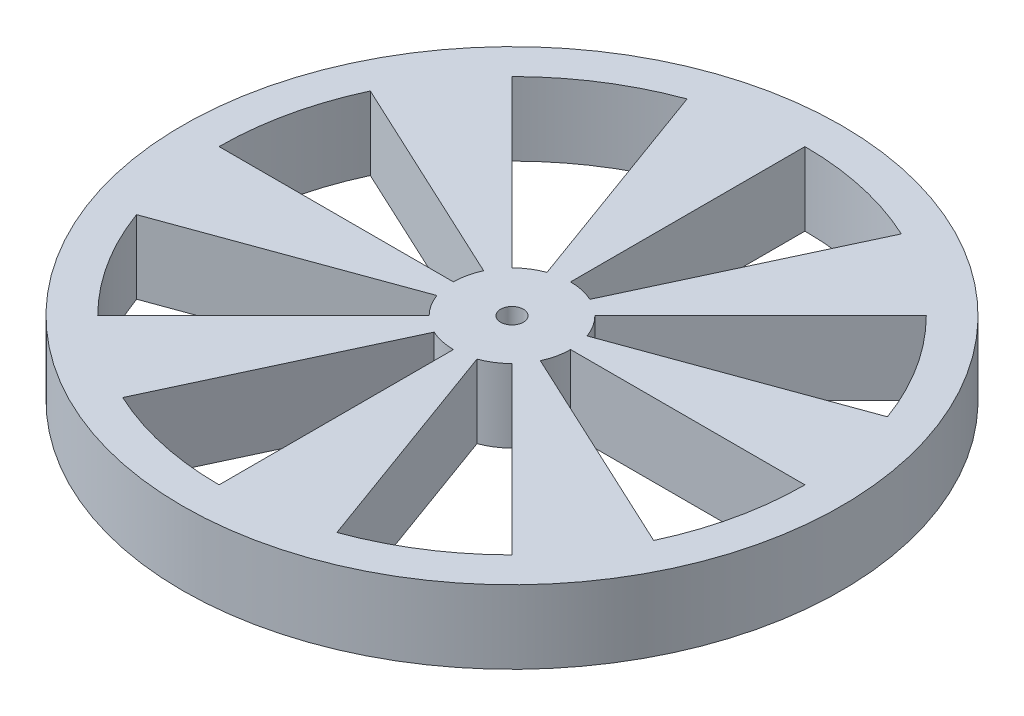
ISO-10303-21;
HEADER;
FILE_DESCRIPTION(('STEP AP214'),'2;1');
FILE_NAME('part.step','',(''),(''),'','','');
FILE_SCHEMA(('AUTOMOTIVE_DESIGN { 1 0 10303 214 1 1 1 1 }'));
ENDSEC;
DATA;
#1=APPLICATION_CONTEXT('core data for automotive mechanical design processes');
#2=APPLICATION_PROTOCOL_DEFINITION('international standard','automotive_design',2000,#1);
#3=PRODUCT_CONTEXT('',#1,'mechanical');
#4=PRODUCT('Part','Part','',(#3));
#5=PRODUCT_RELATED_PRODUCT_CATEGORY('part','',(#4));
#6=PRODUCT_DEFINITION_FORMATION('','',#4);
#7=PRODUCT_DEFINITION_CONTEXT('part definition',#1,'design');
#8=PRODUCT_DEFINITION('design','',#6,#7);
#9=PRODUCT_DEFINITION_SHAPE('','',#8);
#10=(LENGTH_UNIT() NAMED_UNIT(*) SI_UNIT(.MILLI.,.METRE.));
#11=(NAMED_UNIT(*) PLANE_ANGLE_UNIT() SI_UNIT($,.RADIAN.));
#12=(NAMED_UNIT(*) SI_UNIT($,.STERADIAN.) SOLID_ANGLE_UNIT());
#13=UNCERTAINTY_MEASURE_WITH_UNIT(LENGTH_MEASURE(1.E-05),#10,'distance_accuracy_value','');
#14=(GEOMETRIC_REPRESENTATION_CONTEXT(3) GLOBAL_UNCERTAINTY_ASSIGNED_CONTEXT((#13)) GLOBAL_UNIT_ASSIGNED_CONTEXT((#10,
#11,#12)) REPRESENTATION_CONTEXT('',''));
#15=CARTESIAN_POINT('',(0.,0.,0.));
#16=DIRECTION('',(0.,0.,1.));
#17=DIRECTION('',(1.,0.,0.));
#18=AXIS2_PLACEMENT_3D('',#15,#16,#17);
#19=CARTESIAN_POINT('',(0.,10.,0.));
#20=DIRECTION('',(0.,-1.,0.));
#21=DIRECTION('',(0.,0.,-1.));
#22=AXIS2_PLACEMENT_3D('',#19,#20,#21);
#23=CYLINDRICAL_SURFACE('',#22,8.);
#24=CARTESIAN_POINT('',(0.,0.,0.));
#25=DIRECTION('',(0.,1.,0.));
#26=DIRECTION('',(0.,0.,1.));
#27=AXIS2_PLACEMENT_3D('',#24,#25,#26);
#28=CIRCLE('',#27,8.);
#29=CARTESIAN_POINT('',(-2.7361611466054,0.,-7.51754096628725));
#30=VERTEX_POINT('',#29);
#31=CARTESIAN_POINT('',(-5.65685424949231,0.,-5.65685424949245));
#32=VERTEX_POINT('',#31);
#33=EDGE_CURVE('E308',#30,#32,#28,.T.);
#34=ORIENTED_EDGE('',*,*,#33,.T.);
#35=DIRECTION('',(0.,-1.,0.));
#36=VECTOR('',#35,1.);
#37=CARTESIAN_POINT('',(-5.65685424949231,10.,-5.65685424949245));
#38=LINE('',#37,#36);
#39=CARTESIAN_POINT('',(-5.65685424949231,10.,-5.65685424949245));
#40=VERTEX_POINT('',#39);
#41=EDGE_CURVE('E11',#40,#32,#38,.T.);
#42=ORIENTED_EDGE('',*,*,#41,.F.);
#43=CARTESIAN_POINT('',(0.,10.,0.));
#44=DIRECTION('',(0.,1.,0.));
#45=DIRECTION('',(0.,0.,1.));
#46=AXIS2_PLACEMENT_3D('',#43,#44,#45);
#47=CIRCLE('',#46,8.);
#48=CARTESIAN_POINT('',(-2.7361611466054,10.,-7.51754096628725));
#49=VERTEX_POINT('',#48);
#50=EDGE_CURVE('E278',#49,#40,#47,.T.);
#51=ORIENTED_EDGE('',*,*,#50,.F.);
#52=DIRECTION('',(0.,-1.,0.));
#53=VECTOR('',#52,1.);
#54=CARTESIAN_POINT('',(-2.7361611466054,10.,-7.51754096628725));
#55=LINE('',#54,#53);
#56=EDGE_CURVE('E65',#49,#30,#55,.T.);
#57=ORIENTED_EDGE('',*,*,#56,.T.);
#58=EDGE_LOOP('',(#34,#42,#51,#57));
#59=FACE_BOUND('',#58,.T.);
#60=ADVANCED_FACE('F45',(#59),#23,.T.);
#61=CARTESIAN_POINT('',(0.,10.,0.));
#62=DIRECTION('',(0.707106781186556,0.,-0.707106781186539));
#63=DIRECTION('',(-0.707106781186539,0.,-0.707106781186556));
#64=AXIS2_PLACEMENT_3D('',#61,#62,#63);
#65=PLANE('',#64);
#66=DIRECTION('',(0.707106781186539,0.,0.707106781186556));
#67=VECTOR('',#66,1.);
#68=CARTESIAN_POINT('',(0.,0.,0.));
#69=LINE('',#68,#67);
#70=CARTESIAN_POINT('',(-28.2842712474616,0.,-28.2842712474622));
#71=VERTEX_POINT('',#70);
#72=EDGE_CURVE('E266',#71,#32,#69,.T.);
#73=ORIENTED_EDGE('',*,*,#72,.F.);
#74=DIRECTION('',(0.,-1.,0.));
#75=VECTOR('',#74,1.);
#76=CARTESIAN_POINT('',(-28.2842712474616,10.,-28.2842712474622));
#77=LINE('',#76,#75);
#78=CARTESIAN_POINT('',(-28.2842712474616,10.,-28.2842712474622));
#79=VERTEX_POINT('',#78);
#80=EDGE_CURVE('E56',#79,#71,#77,.T.);
#81=ORIENTED_EDGE('',*,*,#80,.F.);
#82=DIRECTION('',(0.707106781186539,0.,0.707106781186556));
#83=VECTOR('',#82,1.);
#84=CARTESIAN_POINT('',(0.,10.,0.));
#85=LINE('',#84,#83);
#86=EDGE_CURVE('E264',#79,#40,#85,.T.);
#87=ORIENTED_EDGE('',*,*,#86,.T.);
#88=ORIENTED_EDGE('',*,*,#41,.T.);
#89=EDGE_LOOP('',(#73,#81,#87,#88));
#90=FACE_BOUND('',#89,.T.);
#91=ADVANCED_FACE('F263',(#90),#65,.T.);
#92=CARTESIAN_POINT('',(0.,10.,0.));
#93=DIRECTION('',(0.,-1.,0.));
#94=DIRECTION('',(0.,0.,-1.));
#95=AXIS2_PLACEMENT_3D('',#92,#93,#94);
#96=CYLINDRICAL_SURFACE('',#95,40.);
#97=CARTESIAN_POINT('',(0.,0.,0.));
#98=DIRECTION('',(0.,1.,0.));
#99=DIRECTION('',(0.,0.,1.));
#100=AXIS2_PLACEMENT_3D('',#97,#98,#99);
#101=CIRCLE('',#100,40.);
#102=CARTESIAN_POINT('',(-13.680805733027,0.,-37.5877048314362));
#103=VERTEX_POINT('',#102);
#104=EDGE_CURVE('E396',#103,#71,#101,.T.);
#105=ORIENTED_EDGE('',*,*,#104,.F.);
#106=DIRECTION('',(0.,-1.,0.));
#107=VECTOR('',#106,1.);
#108=CARTESIAN_POINT('',(-13.680805733027,10.,-37.5877048314362));
#109=LINE('',#108,#107);
#110=CARTESIAN_POINT('',(-13.680805733027,10.,-37.5877048314362));
#111=VERTEX_POINT('',#110);
#112=EDGE_CURVE('E162',#111,#103,#109,.T.);
#113=ORIENTED_EDGE('',*,*,#112,.F.);
#114=CARTESIAN_POINT('',(0.,10.,0.));
#115=DIRECTION('',(0.,1.,0.));
#116=DIRECTION('',(0.,0.,1.));
#117=AXIS2_PLACEMENT_3D('',#114,#115,#116);
#118=CIRCLE('',#117,40.);
#119=EDGE_CURVE('E277',#111,#79,#118,.T.);
#120=ORIENTED_EDGE('',*,*,#119,.T.);
#121=ORIENTED_EDGE('',*,*,#80,.T.);
#122=EDGE_LOOP('',(#105,#113,#120,#121));
#123=FACE_BOUND('',#122,.T.);
#124=ADVANCED_FACE('F282',(#123),#96,.F.);
#125=CARTESIAN_POINT('',(0.,10.,0.));
#126=DIRECTION('',(-0.422618261740694,0.,0.906307787036653));
#127=DIRECTION('',(0.906307787036653,0.,0.422618261740694));
#128=AXIS2_PLACEMENT_3D('',#125,#126,#127);
#129=PLANE('',#128);
#130=DIRECTION('',(-0.906307787036653,0.,-0.422618261740693));
#131=VECTOR('',#130,1.);
#132=CARTESIAN_POINT('',(0.,0.,0.));
#133=LINE('',#132,#131);
#134=CARTESIAN_POINT('',(-7.25046229629322,0.,-3.38094609392555));
#135=VERTEX_POINT('',#134);
#136=CARTESIAN_POINT('',(-36.2523114814661,0.,-16.9047304696277));
#137=VERTEX_POINT('',#136);
#138=EDGE_CURVE('E381',#135,#137,#133,.T.);
#139=ORIENTED_EDGE('',*,*,#138,.F.);
#140=DIRECTION('',(0.,-1.,0.));
#141=VECTOR('',#140,1.);
#142=CARTESIAN_POINT('',(-7.25046229629322,10.,-3.38094609392555));
#143=LINE('',#142,#141);
#144=CARTESIAN_POINT('',(-7.25046229629322,10.,-3.38094609392555));
#145=VERTEX_POINT('',#144);
#146=EDGE_CURVE('E414',#145,#135,#143,.T.);
#147=ORIENTED_EDGE('',*,*,#146,.F.);
#148=DIRECTION('',(-0.906307787036653,0.,-0.422618261740693));
#149=VECTOR('',#148,1.);
#150=CARTESIAN_POINT('',(0.,10.,0.));
#151=LINE('',#150,#149);
#152=CARTESIAN_POINT('',(-36.2523114814661,10.,-16.9047304696277));
#153=VERTEX_POINT('',#152);
#154=EDGE_CURVE('E694',#145,#153,#151,.T.);
#155=ORIENTED_EDGE('',*,*,#154,.T.);
#156=DIRECTION('',(0.,-1.,0.));
#157=VECTOR('',#156,1.);
#158=CARTESIAN_POINT('',(-36.2523114814661,10.,-16.9047304696277));
#159=LINE('',#158,#157);
#160=EDGE_CURVE('E417',#153,#137,#159,.T.);
#161=ORIENTED_EDGE('',*,*,#160,.T.);
#162=EDGE_LOOP('',(#139,#147,#155,#161));
#163=FACE_BOUND('',#162,.T.);
#164=ADVANCED_FACE('F536',(#163),#129,.T.);
#165=CARTESIAN_POINT('',(-8.,0.,0.));
#166=VERTEX_POINT('',#165);
#167=EDGE_CURVE('E385',#135,#166,#28,.T.);
#168=ORIENTED_EDGE('',*,*,#167,.T.);
#169=DIRECTION('',(0.,-1.,0.));
#170=VECTOR('',#169,1.);
#171=CARTESIAN_POINT('',(-8.,10.,0.));
#172=LINE('',#171,#170);
#173=CARTESIAN_POINT('',(-8.,10.,0.));
#174=VERTEX_POINT('',#173);
#175=EDGE_CURVE('E424',#174,#166,#172,.T.);
#176=ORIENTED_EDGE('',*,*,#175,.F.);
#177=EDGE_CURVE('E698',#145,#174,#47,.T.);
#178=ORIENTED_EDGE('',*,*,#177,.F.);
#179=ORIENTED_EDGE('',*,*,#146,.T.);
#180=EDGE_LOOP('',(#168,#176,#178,#179));
#181=FACE_BOUND('',#180,.T.);
#182=ADVANCED_FACE('F528',(#181),#23,.T.);
#183=CARTESIAN_POINT('',(0.,10.,0.));
#184=DIRECTION('',(0.,0.,-1.));
#185=DIRECTION('',(-1.,0.,0.));
#186=AXIS2_PLACEMENT_3D('',#183,#184,#185);
#187=PLANE('',#186);
#188=DIRECTION('',(1.,0.,0.));
#189=VECTOR('',#188,1.);
#190=CARTESIAN_POINT('',(0.,0.,0.));
#191=LINE('',#190,#189);
#192=CARTESIAN_POINT('',(-40.,0.,-4.18977760661176E-13));
#193=VERTEX_POINT('',#192);
#194=EDGE_CURVE('E386',#193,#166,#191,.T.);
#195=ORIENTED_EDGE('',*,*,#194,.F.);
#196=DIRECTION('',(0.,-1.,0.));
#197=VECTOR('',#196,1.);
#198=CARTESIAN_POINT('',(-40.,10.,-4.18977760661176E-13));
#199=LINE('',#198,#197);
#200=CARTESIAN_POINT('',(-40.,10.,-4.18977760661176E-13));
#201=VERTEX_POINT('',#200);
#202=EDGE_CURVE('E420',#201,#193,#199,.T.);
#203=ORIENTED_EDGE('',*,*,#202,.F.);
#204=DIRECTION('',(1.,0.,0.));
#205=VECTOR('',#204,1.);
#206=CARTESIAN_POINT('',(0.,10.,0.));
#207=LINE('',#206,#205);
#208=EDGE_CURVE('E699',#201,#174,#207,.T.);
#209=ORIENTED_EDGE('',*,*,#208,.T.);
#210=ORIENTED_EDGE('',*,*,#175,.T.);
#211=EDGE_LOOP('',(#195,#203,#209,#210));
#212=FACE_BOUND('',#211,.T.);
#213=ADVANCED_FACE('F535',(#212),#187,.T.);
#214=CARTESIAN_POINT('',(0.,10.,0.));
#215=DIRECTION('',(0.342020143325675,0.,0.939692620785906));
#216=DIRECTION('',(0.939692620785906,0.,-0.342020143325675));
#217=AXIS2_PLACEMENT_3D('',#214,#215,#216);
#218=PLANE('',#217);
#219=DIRECTION('',(-0.939692620785906,0.,0.342020143325675));
#220=VECTOR('',#219,1.);
#221=CARTESIAN_POINT('',(0.,0.,0.));
#222=LINE('',#221,#220);
#223=CARTESIAN_POINT('',(-7.51754096628725,0.,2.7361611466054));
#224=VERTEX_POINT('',#223);
#225=CARTESIAN_POINT('',(-37.5877048314362,0.,13.680805733027));
#226=VERTEX_POINT('',#225);
#227=EDGE_CURVE('E368',#224,#226,#222,.T.);
#228=ORIENTED_EDGE('',*,*,#227,.F.);
#229=DIRECTION('',(0.,-1.,0.));
#230=VECTOR('',#229,1.);
#231=CARTESIAN_POINT('',(-7.51754096628725,10.,2.7361611466054));
#232=LINE('',#231,#230);
#233=CARTESIAN_POINT('',(-7.51754096628725,10.,2.7361611466054));
#234=VERTEX_POINT('',#233);
#235=EDGE_CURVE('E421',#234,#224,#232,.T.);
#236=ORIENTED_EDGE('',*,*,#235,.F.);
#237=DIRECTION('',(-0.939692620785906,0.,0.342020143325675));
#238=VECTOR('',#237,1.);
#239=CARTESIAN_POINT('',(0.,10.,0.));
#240=LINE('',#239,#238);
#241=CARTESIAN_POINT('',(-37.5877048314362,10.,13.680805733027));
#242=VERTEX_POINT('',#241);
#243=EDGE_CURVE('E681',#234,#242,#240,.T.);
#244=ORIENTED_EDGE('',*,*,#243,.T.);
#245=DIRECTION('',(0.,-1.,0.));
#246=VECTOR('',#245,1.);
#247=CARTESIAN_POINT('',(-37.5877048314362,10.,13.680805733027));
#248=LINE('',#247,#246);
#249=EDGE_CURVE('E429',#242,#226,#248,.T.);
#250=ORIENTED_EDGE('',*,*,#249,.T.);
#251=EDGE_LOOP('',(#228,#236,#244,#250));
#252=FACE_BOUND('',#251,.T.);
#253=ADVANCED_FACE('F543',(#252),#218,.T.);
#254=CARTESIAN_POINT('',(-5.65685424949243,0.,5.65685424949233));
#255=VERTEX_POINT('',#254);
#256=EDGE_CURVE('E372',#224,#255,#28,.T.);
#257=ORIENTED_EDGE('',*,*,#256,.T.);
#258=DIRECTION('',(0.,-1.,0.));
#259=VECTOR('',#258,1.);
#260=CARTESIAN_POINT('',(-5.65685424949243,10.,5.65685424949233));
#261=LINE('',#260,#259);
#262=CARTESIAN_POINT('',(-5.65685424949243,10.,5.65685424949233));
#263=VERTEX_POINT('',#262);
#264=EDGE_CURVE('E436',#263,#255,#261,.T.);
#265=ORIENTED_EDGE('',*,*,#264,.F.);
#266=EDGE_CURVE('E685',#234,#263,#47,.T.);
#267=ORIENTED_EDGE('',*,*,#266,.F.);
#268=ORIENTED_EDGE('',*,*,#235,.T.);
#269=EDGE_LOOP('',(#257,#265,#267,#268));
#270=FACE_BOUND('',#269,.T.);
#271=ADVANCED_FACE('F538',(#270),#23,.T.);
#272=CARTESIAN_POINT('',(0.,10.,0.));
#273=DIRECTION('',(-0.707106781186541,0.,-0.707106781186554));
#274=DIRECTION('',(-0.707106781186554,0.,0.707106781186541));
#275=AXIS2_PLACEMENT_3D('',#272,#273,#274);
#276=PLANE('',#275);
#277=DIRECTION('',(0.707106781186554,0.,-0.707106781186541));
#278=VECTOR('',#277,1.);
#279=CARTESIAN_POINT('',(0.,0.,0.));
#280=LINE('',#279,#278);
#281=CARTESIAN_POINT('',(-28.2842712474621,0.,28.2842712474617));
#282=VERTEX_POINT('',#281);
#283=EDGE_CURVE('E373',#282,#255,#280,.T.);
#284=ORIENTED_EDGE('',*,*,#283,.F.);
#285=DIRECTION('',(0.,-1.,0.));
#286=VECTOR('',#285,1.);
#287=CARTESIAN_POINT('',(-28.2842712474621,10.,28.2842712474617));
#288=LINE('',#287,#286);
#289=CARTESIAN_POINT('',(-28.2842712474621,10.,28.2842712474617));
#290=VERTEX_POINT('',#289);
#291=EDGE_CURVE('E432',#290,#282,#288,.T.);
#292=ORIENTED_EDGE('',*,*,#291,.F.);
#293=DIRECTION('',(0.707106781186554,0.,-0.707106781186541));
#294=VECTOR('',#293,1.);
#295=CARTESIAN_POINT('',(0.,10.,0.));
#296=LINE('',#295,#294);
#297=EDGE_CURVE('E686',#290,#263,#296,.T.);
#298=ORIENTED_EDGE('',*,*,#297,.T.);
#299=ORIENTED_EDGE('',*,*,#264,.T.);
#300=EDGE_LOOP('',(#284,#292,#298,#299));
#301=FACE_BOUND('',#300,.T.);
#302=ADVANCED_FACE('F550',(#301),#276,.T.);
#303=CARTESIAN_POINT('',(0.,10.,0.));
#304=DIRECTION('',(0.906307787036653,0.,0.422618261740694));
#305=DIRECTION('',(0.422618261740694,0.,-0.906307787036653));
#306=AXIS2_PLACEMENT_3D('',#303,#304,#305);
#307=PLANE('',#306);
#308=DIRECTION('',(-0.422618261740693,0.,0.906307787036653));
#309=VECTOR('',#308,1.);
#310=CARTESIAN_POINT('',(0.,0.,0.));
#311=LINE('',#310,#309);
#312=CARTESIAN_POINT('',(-3.38094609392555,0.,7.25046229629322));
#313=VERTEX_POINT('',#312);
#314=CARTESIAN_POINT('',(-16.9047304696277,0.,36.2523114814661));
#315=VERTEX_POINT('',#314);
#316=EDGE_CURVE('E355',#313,#315,#311,.T.);
#317=ORIENTED_EDGE('',*,*,#316,.F.);
#318=DIRECTION('',(0.,-1.,0.));
#319=VECTOR('',#318,1.);
#320=CARTESIAN_POINT('',(-3.38094609392555,10.,7.25046229629322));
#321=LINE('',#320,#319);
#322=CARTESIAN_POINT('',(-3.38094609392555,10.,7.25046229629322));
#323=VERTEX_POINT('',#322);
#324=EDGE_CURVE('E433',#323,#313,#321,.T.);
#325=ORIENTED_EDGE('',*,*,#324,.F.);
#326=DIRECTION('',(-0.422618261740693,0.,0.906307787036653));
#327=VECTOR('',#326,1.);
#328=CARTESIAN_POINT('',(0.,10.,0.));
#329=LINE('',#328,#327);
#330=CARTESIAN_POINT('',(-16.9047304696277,10.,36.2523114814661));
#331=VERTEX_POINT('',#330);
#332=EDGE_CURVE('E668',#323,#331,#329,.T.);
#333=ORIENTED_EDGE('',*,*,#332,.T.);
#334=DIRECTION('',(0.,-1.,0.));
#335=VECTOR('',#334,1.);
#336=CARTESIAN_POINT('',(-16.9047304696277,10.,36.2523114814661));
#337=LINE('',#336,#335);
#338=EDGE_CURVE('E441',#331,#315,#337,.T.);
#339=ORIENTED_EDGE('',*,*,#338,.T.);
#340=EDGE_LOOP('',(#317,#325,#333,#339));
#341=FACE_BOUND('',#340,.T.);
#342=ADVANCED_FACE('F557',(#341),#307,.T.);
#343=CARTESIAN_POINT('',(0.,0.,8.));
#344=VERTEX_POINT('',#343);
#345=EDGE_CURVE('E359',#313,#344,#28,.T.);
#346=ORIENTED_EDGE('',*,*,#345,.T.);
#347=DIRECTION('',(0.,-1.,0.));
#348=VECTOR('',#347,1.);
#349=CARTESIAN_POINT('',(0.,10.,8.));
#350=LINE('',#349,#348);
#351=CARTESIAN_POINT('',(0.,10.,8.));
#352=VERTEX_POINT('',#351);
#353=EDGE_CURVE('E448',#352,#344,#350,.T.);
#354=ORIENTED_EDGE('',*,*,#353,.F.);
#355=EDGE_CURVE('E672',#323,#352,#47,.T.);
#356=ORIENTED_EDGE('',*,*,#355,.F.);
#357=ORIENTED_EDGE('',*,*,#324,.T.);
#358=EDGE_LOOP('',(#346,#354,#356,#357));
#359=FACE_BOUND('',#358,.T.);
#360=ADVANCED_FACE('F552',(#359),#23,.T.);
#361=CARTESIAN_POINT('',(0.,10.,0.));
#362=DIRECTION('',(-1.,0.,0.));
#363=DIRECTION('',(0.,0.,1.));
#364=AXIS2_PLACEMENT_3D('',#361,#362,#363);
#365=PLANE('',#364);
#366=DIRECTION('',(0.,0.,-1.));
#367=VECTOR('',#366,1.);
#368=CARTESIAN_POINT('',(0.,0.,0.));
#369=LINE('',#368,#367);
#370=CARTESIAN_POINT('',(-2.79318507107451E-13,0.,40.));
#371=VERTEX_POINT('',#370);
#372=EDGE_CURVE('E360',#371,#344,#369,.T.);
#373=ORIENTED_EDGE('',*,*,#372,.F.);
#374=DIRECTION('',(0.,-1.,0.));
#375=VECTOR('',#374,1.);
#376=CARTESIAN_POINT('',(-2.79318507107451E-13,10.,40.));
#377=LINE('',#376,#375);
#378=CARTESIAN_POINT('',(-2.79318507107451E-13,10.,40.));
#379=VERTEX_POINT('',#378);
#380=EDGE_CURVE('E444',#379,#371,#377,.T.);
#381=ORIENTED_EDGE('',*,*,#380,.F.);
#382=DIRECTION('',(0.,0.,-1.));
#383=VECTOR('',#382,1.);
#384=CARTESIAN_POINT('',(0.,10.,0.));
#385=LINE('',#384,#383);
#386=EDGE_CURVE('E673',#379,#352,#385,.T.);
#387=ORIENTED_EDGE('',*,*,#386,.T.);
#388=ORIENTED_EDGE('',*,*,#353,.T.);
#389=EDGE_LOOP('',(#373,#381,#387,#388));
#390=FACE_BOUND('',#389,.T.);
#391=ADVANCED_FACE('F564',(#390),#365,.T.);
#392=CARTESIAN_POINT('',(0.,10.,0.));
#393=DIRECTION('',(0.939692620785906,0.,-0.342020143325675));
#394=DIRECTION('',(-0.342020143325675,0.,-0.939692620785906));
#395=AXIS2_PLACEMENT_3D('',#392,#393,#394);
#396=PLANE('',#395);
#397=DIRECTION('',(0.342020143325675,0.,0.939692620785906));
#398=VECTOR('',#397,1.);
#399=CARTESIAN_POINT('',(0.,0.,0.));
#400=LINE('',#399,#398);
#401=CARTESIAN_POINT('',(2.7361611466054,0.,7.51754096628725));
#402=VERTEX_POINT('',#401);
#403=CARTESIAN_POINT('',(13.680805733027,0.,37.5877048314362));
#404=VERTEX_POINT('',#403);
#405=EDGE_CURVE('E342',#402,#404,#400,.T.);
#406=ORIENTED_EDGE('',*,*,#405,.F.);
#407=DIRECTION('',(0.,-1.,0.));
#408=VECTOR('',#407,1.);
#409=CARTESIAN_POINT('',(2.7361611466054,10.,7.51754096628725));
#410=LINE('',#409,#408);
#411=CARTESIAN_POINT('',(2.7361611466054,10.,7.51754096628725));
#412=VERTEX_POINT('',#411);
#413=EDGE_CURVE('E445',#412,#402,#410,.T.);
#414=ORIENTED_EDGE('',*,*,#413,.F.);
#415=DIRECTION('',(0.342020143325675,0.,0.939692620785906));
#416=VECTOR('',#415,1.);
#417=CARTESIAN_POINT('',(0.,10.,0.));
#418=LINE('',#417,#416);
#419=CARTESIAN_POINT('',(13.680805733027,10.,37.5877048314362));
#420=VERTEX_POINT('',#419);
#421=EDGE_CURVE('E655',#412,#420,#418,.T.);
#422=ORIENTED_EDGE('',*,*,#421,.T.);
#423=DIRECTION('',(0.,-1.,0.));
#424=VECTOR('',#423,1.);
#425=CARTESIAN_POINT('',(13.680805733027,10.,37.5877048314362));
#426=LINE('',#425,#424);
#427=EDGE_CURVE('E453',#420,#404,#426,.T.);
#428=ORIENTED_EDGE('',*,*,#427,.T.);
#429=EDGE_LOOP('',(#406,#414,#422,#428));
#430=FACE_BOUND('',#429,.T.);
#431=ADVANCED_FACE('F571',(#430),#396,.T.);
#432=CARTESIAN_POINT('',(5.65685424949235,0.,5.65685424949241));
#433=VERTEX_POINT('',#432);
#434=EDGE_CURVE('E346',#402,#433,#28,.T.);
#435=ORIENTED_EDGE('',*,*,#434,.T.);
#436=DIRECTION('',(0.,-1.,0.));
#437=VECTOR('',#436,1.);
#438=CARTESIAN_POINT('',(5.65685424949235,10.,5.65685424949241));
#439=LINE('',#438,#437);
#440=CARTESIAN_POINT('',(5.65685424949235,10.,5.65685424949241));
#441=VERTEX_POINT('',#440);
#442=EDGE_CURVE('E460',#441,#433,#439,.T.);
#443=ORIENTED_EDGE('',*,*,#442,.F.);
#444=EDGE_CURVE('E659',#412,#441,#47,.T.);
#445=ORIENTED_EDGE('',*,*,#444,.F.);
#446=ORIENTED_EDGE('',*,*,#413,.T.);
#447=EDGE_LOOP('',(#435,#443,#445,#446));
#448=FACE_BOUND('',#447,.T.);
#449=ADVANCED_FACE('F566',(#448),#23,.T.);
#450=CARTESIAN_POINT('',(0.,10.,0.));
#451=DIRECTION('',(-0.707106781186551,0.,0.707106781186544));
#452=DIRECTION('',(0.707106781186544,0.,0.707106781186551));
#453=AXIS2_PLACEMENT_3D('',#450,#451,#452);
#454=PLANE('',#453);
#455=DIRECTION('',(-0.707106781186544,0.,-0.707106781186551));
#456=VECTOR('',#455,1.);
#457=CARTESIAN_POINT('',(0.,0.,0.));
#458=LINE('',#457,#456);
#459=CARTESIAN_POINT('',(28.2842712474618,0.,28.2842712474621));
#460=VERTEX_POINT('',#459);
#461=EDGE_CURVE('E347',#460,#433,#458,.T.);
#462=ORIENTED_EDGE('',*,*,#461,.F.);
#463=DIRECTION('',(0.,-1.,0.));
#464=VECTOR('',#463,1.);
#465=CARTESIAN_POINT('',(28.2842712474618,10.,28.2842712474621));
#466=LINE('',#465,#464);
#467=CARTESIAN_POINT('',(28.2842712474618,10.,28.2842712474621));
#468=VERTEX_POINT('',#467);
#469=EDGE_CURVE('E456',#468,#460,#466,.T.);
#470=ORIENTED_EDGE('',*,*,#469,.F.);
#471=DIRECTION('',(-0.707106781186544,0.,-0.707106781186551));
#472=VECTOR('',#471,1.);
#473=CARTESIAN_POINT('',(0.,10.,0.));
#474=LINE('',#473,#472);
#475=EDGE_CURVE('E660',#468,#441,#474,.T.);
#476=ORIENTED_EDGE('',*,*,#475,.T.);
#477=ORIENTED_EDGE('',*,*,#442,.T.);
#478=EDGE_LOOP('',(#462,#470,#476,#477));
#479=FACE_BOUND('',#478,.T.);
#480=ADVANCED_FACE('F578',(#479),#454,.T.);
#481=CARTESIAN_POINT('',(0.,10.,0.));
#482=DIRECTION('',(0.422618261740694,0.,-0.906307787036653));
#483=DIRECTION('',(-0.906307787036653,0.,-0.422618261740694));
#484=AXIS2_PLACEMENT_3D('',#481,#482,#483);
#485=PLANE('',#484);
#486=DIRECTION('',(0.906307787036653,0.,0.422618261740694));
#487=VECTOR('',#486,1.);
#488=CARTESIAN_POINT('',(0.,0.,0.));
#489=LINE('',#488,#487);
#490=CARTESIAN_POINT('',(7.25046229629322,0.,3.38094609392555));
#491=VERTEX_POINT('',#490);
#492=CARTESIAN_POINT('',(36.2523114814661,0.,16.9047304696277));
#493=VERTEX_POINT('',#492);
#494=EDGE_CURVE('E329',#491,#493,#489,.T.);
#495=ORIENTED_EDGE('',*,*,#494,.F.);
#496=DIRECTION('',(0.,-1.,0.));
#497=VECTOR('',#496,1.);
#498=CARTESIAN_POINT('',(7.25046229629322,10.,3.38094609392555));
#499=LINE('',#498,#497);
#500=CARTESIAN_POINT('',(7.25046229629322,10.,3.38094609392555));
#501=VERTEX_POINT('',#500);
#502=EDGE_CURVE('E457',#501,#491,#499,.T.);
#503=ORIENTED_EDGE('',*,*,#502,.F.);
#504=DIRECTION('',(0.906307787036653,0.,0.422618261740694));
#505=VECTOR('',#504,1.);
#506=CARTESIAN_POINT('',(0.,10.,0.));
#507=LINE('',#506,#505);
#508=CARTESIAN_POINT('',(36.2523114814661,10.,16.9047304696277));
#509=VERTEX_POINT('',#508);
#510=EDGE_CURVE('E636',#501,#509,#507,.T.);
#511=ORIENTED_EDGE('',*,*,#510,.T.);
#512=DIRECTION('',(0.,-1.,0.));
#513=VECTOR('',#512,1.);
#514=CARTESIAN_POINT('',(36.2523114814661,10.,16.9047304696277));
#515=LINE('',#514,#513);
#516=EDGE_CURVE('E465',#509,#493,#515,.T.);
#517=ORIENTED_EDGE('',*,*,#516,.T.);
#518=EDGE_LOOP('',(#495,#503,#511,#517));
#519=FACE_BOUND('',#518,.T.);
#520=ADVANCED_FACE('F585',(#519),#485,.T.);
#521=CARTESIAN_POINT('',(8.,0.,0.));
#522=VERTEX_POINT('',#521);
#523=EDGE_CURVE('E333',#491,#522,#28,.T.);
#524=ORIENTED_EDGE('',*,*,#523,.T.);
#525=DIRECTION('',(0.,-1.,0.));
#526=VECTOR('',#525,1.);
#527=CARTESIAN_POINT('',(8.,10.,0.));
#528=LINE('',#527,#526);
#529=CARTESIAN_POINT('',(8.,10.,0.));
#530=VERTEX_POINT('',#529);
#531=EDGE_CURVE('E472',#530,#522,#528,.T.);
#532=ORIENTED_EDGE('',*,*,#531,.F.);
#533=EDGE_CURVE('E640',#501,#530,#47,.T.);
#534=ORIENTED_EDGE('',*,*,#533,.F.);
#535=ORIENTED_EDGE('',*,*,#502,.T.);
#536=EDGE_LOOP('',(#524,#532,#534,#535));
#537=FACE_BOUND('',#536,.T.);
#538=ADVANCED_FACE('F580',(#537),#23,.T.);
#539=CARTESIAN_POINT('',(0.,10.,0.));
#540=DIRECTION('',(0.,0.,1.));
#541=DIRECTION('',(1.,0.,0.));
#542=AXIS2_PLACEMENT_3D('',#539,#540,#541);
#543=PLANE('',#542);
#544=DIRECTION('',(-1.,0.,0.));
#545=VECTOR('',#544,1.);
#546=CARTESIAN_POINT('',(0.,0.,0.));
#547=LINE('',#546,#545);
#548=CARTESIAN_POINT('',(40.,0.,1.39659253553725E-13));
#549=VERTEX_POINT('',#548);
#550=EDGE_CURVE('E334',#549,#522,#547,.T.);
#551=ORIENTED_EDGE('',*,*,#550,.F.);
#552=DIRECTION('',(0.,-1.,0.));
#553=VECTOR('',#552,1.);
#554=CARTESIAN_POINT('',(40.,10.,1.39659253553725E-13));
#555=LINE('',#554,#553);
#556=CARTESIAN_POINT('',(40.,10.,1.39659253553725E-13));
#557=VERTEX_POINT('',#556);
#558=EDGE_CURVE('E468',#557,#549,#555,.T.);
#559=ORIENTED_EDGE('',*,*,#558,.F.);
#560=DIRECTION('',(-1.,0.,0.));
#561=VECTOR('',#560,1.);
#562=CARTESIAN_POINT('',(0.,10.,0.));
#563=LINE('',#562,#561);
#564=EDGE_CURVE('E647',#557,#530,#563,.T.);
#565=ORIENTED_EDGE('',*,*,#564,.T.);
#566=ORIENTED_EDGE('',*,*,#531,.T.);
#567=EDGE_LOOP('',(#551,#559,#565,#566));
#568=FACE_BOUND('',#567,.T.);
#569=ADVANCED_FACE('F592',(#568),#543,.T.);
#570=CARTESIAN_POINT('',(0.,10.,0.));
#571=DIRECTION('',(-0.342020143325673,0.,-0.939692620785907));
#572=DIRECTION('',(-0.939692620785907,0.,0.342020143325673));
#573=AXIS2_PLACEMENT_3D('',#570,#571,#572);
#574=PLANE('',#573);
#575=DIRECTION('',(0.939692620785907,0.,-0.342020143325673));
#576=VECTOR('',#575,1.);
#577=CARTESIAN_POINT('',(0.,0.,0.));
#578=LINE('',#577,#576);
#579=CARTESIAN_POINT('',(7.51754096628725,0.,-2.73616114660539));
#580=VERTEX_POINT('',#579);
#581=CARTESIAN_POINT('',(37.5877048314363,0.,-13.6808057330269));
#582=VERTEX_POINT('',#581);
#583=EDGE_CURVE('E317',#580,#582,#578,.T.);
#584=ORIENTED_EDGE('',*,*,#583,.F.);
#585=DIRECTION('',(0.,-1.,0.));
#586=VECTOR('',#585,1.);
#587=CARTESIAN_POINT('',(7.51754096628725,10.,-2.73616114660539));
#588=LINE('',#587,#586);
#589=CARTESIAN_POINT('',(7.51754096628725,10.,-2.73616114660539));
#590=VERTEX_POINT('',#589);
#591=EDGE_CURVE('E469',#590,#580,#588,.T.);
#592=ORIENTED_EDGE('',*,*,#591,.F.);
#593=DIRECTION('',(0.939692620785907,0.,-0.342020143325673));
#594=VECTOR('',#593,1.);
#595=CARTESIAN_POINT('',(0.,10.,0.));
#596=LINE('',#595,#594);
#597=CARTESIAN_POINT('',(37.5877048314363,10.,-13.6808057330269));
#598=VERTEX_POINT('',#597);
#599=EDGE_CURVE('E638',#590,#598,#596,.T.);
#600=ORIENTED_EDGE('',*,*,#599,.T.);
#601=DIRECTION('',(0.,-1.,0.));
#602=VECTOR('',#601,1.);
#603=CARTESIAN_POINT('',(37.5877048314363,10.,-13.6808057330269));
#604=LINE('',#603,#602);
#605=EDGE_CURVE('E477',#598,#582,#604,.T.);
#606=ORIENTED_EDGE('',*,*,#605,.T.);
#607=EDGE_LOOP('',(#584,#592,#600,#606));
#608=FACE_BOUND('',#607,.T.);
#609=ADVANCED_FACE('F598',(#608),#574,.T.);
#610=CARTESIAN_POINT('',(5.65685424949239,0.,-5.65685424949237));
#611=VERTEX_POINT('',#610);
#612=EDGE_CURVE('E309',#580,#611,#28,.T.);
#613=ORIENTED_EDGE('',*,*,#612,.T.);
#614=DIRECTION('',(0.,-1.,0.));
#615=VECTOR('',#614,1.);
#616=CARTESIAN_POINT('',(5.65685424949239,10.,-5.65685424949237));
#617=LINE('',#616,#615);
#618=CARTESIAN_POINT('',(5.65685424949239,10.,-5.65685424949237));
#619=VERTEX_POINT('',#618);
#620=EDGE_CURVE('E483',#619,#611,#617,.T.);
#621=ORIENTED_EDGE('',*,*,#620,.F.);
#622=EDGE_CURVE('E632',#590,#619,#47,.T.);
#623=ORIENTED_EDGE('',*,*,#622,.F.);
#624=ORIENTED_EDGE('',*,*,#591,.T.);
#625=EDGE_LOOP('',(#613,#621,#623,#624));
#626=FACE_BOUND('',#625,.T.);
#627=ADVANCED_FACE('F525',(#626),#23,.T.);
#628=CARTESIAN_POINT('',(0.,10.,0.));
#629=DIRECTION('',(0.707106781186546,0.,0.707106781186549));
#630=DIRECTION('',(0.707106781186549,0.,-0.707106781186546));
#631=AXIS2_PLACEMENT_3D('',#628,#629,#630);
#632=PLANE('',#631);
#633=DIRECTION('',(-0.707106781186549,0.,0.707106781186546));
#634=VECTOR('',#633,1.);
#635=CARTESIAN_POINT('',(0.,0.,0.));
#636=LINE('',#635,#634);
#637=CARTESIAN_POINT('',(28.284271247462,0.,-28.2842712474619));
#638=VERTEX_POINT('',#637);
#639=EDGE_CURVE('E321',#638,#611,#636,.T.);
#640=ORIENTED_EDGE('',*,*,#639,.F.);
#641=DIRECTION('',(0.,-1.,0.));
#642=VECTOR('',#641,1.);
#643=CARTESIAN_POINT('',(28.284271247462,10.,-28.2842712474619));
#644=LINE('',#643,#642);
#645=CARTESIAN_POINT('',(28.284271247462,10.,-28.2842712474619));
#646=VERTEX_POINT('',#645);
#647=EDGE_CURVE('E480',#646,#638,#644,.T.);
#648=ORIENTED_EDGE('',*,*,#647,.F.);
#649=DIRECTION('',(-0.707106781186549,0.,0.707106781186546));
#650=VECTOR('',#649,1.);
#651=CARTESIAN_POINT('',(0.,10.,0.));
#652=LINE('',#651,#650);
#653=EDGE_CURVE('E626',#646,#619,#652,.T.);
#654=ORIENTED_EDGE('',*,*,#653,.T.);
#655=ORIENTED_EDGE('',*,*,#620,.T.);
#656=EDGE_LOOP('',(#640,#648,#654,#655));
#657=FACE_BOUND('',#656,.T.);
#658=ADVANCED_FACE('F605',(#657),#632,.T.);
#659=CARTESIAN_POINT('',(0.,10.,0.));
#660=DIRECTION('',(-0.906307787036653,0.,-0.422618261740694));
#661=DIRECTION('',(-0.422618261740694,0.,0.906307787036653));
#662=AXIS2_PLACEMENT_3D('',#659,#660,#661);
#663=PLANE('',#662);
#664=DIRECTION('',(0.422618261740694,0.,-0.906307787036653));
#665=VECTOR('',#664,1.);
#666=CARTESIAN_POINT('',(0.,0.,0.));
#667=LINE('',#666,#665);
#668=CARTESIAN_POINT('',(3.38094609392555,0.,-7.25046229629322));
#669=VERTEX_POINT('',#668);
#670=CARTESIAN_POINT('',(16.9047304696277,0.,-36.2523114814661));
#671=VERTEX_POINT('',#670);
#672=EDGE_CURVE('E299',#669,#671,#667,.T.);
#673=ORIENTED_EDGE('',*,*,#672,.F.);
#674=DIRECTION('',(0.,-1.,0.));
#675=VECTOR('',#674,1.);
#676=CARTESIAN_POINT('',(3.38094609392555,10.,-7.25046229629322));
#677=LINE('',#676,#675);
#678=CARTESIAN_POINT('',(3.38094609392555,10.,-7.25046229629322));
#679=VERTEX_POINT('',#678);
#680=EDGE_CURVE('E49',#679,#669,#677,.T.);
#681=ORIENTED_EDGE('',*,*,#680,.F.);
#682=DIRECTION('',(0.422618261740694,0.,-0.906307787036653));
#683=VECTOR('',#682,1.);
#684=CARTESIAN_POINT('',(0.,10.,0.));
#685=LINE('',#684,#683);
#686=CARTESIAN_POINT('',(16.9047304696277,10.,-36.2523114814661));
#687=VERTEX_POINT('',#686);
#688=EDGE_CURVE('E411',#679,#687,#685,.T.);
#689=ORIENTED_EDGE('',*,*,#688,.T.);
#690=DIRECTION('',(0.,-1.,0.));
#691=VECTOR('',#690,1.);
#692=CARTESIAN_POINT('',(16.9047304696277,10.,-36.2523114814661));
#693=LINE('',#692,#691);
#694=EDGE_CURVE('E298',#687,#671,#693,.T.);
#695=ORIENTED_EDGE('',*,*,#694,.T.);
#696=EDGE_LOOP('',(#673,#681,#689,#695));
#697=FACE_BOUND('',#696,.T.);
#698=ADVANCED_FACE('F47',(#697),#663,.T.);
#699=CARTESIAN_POINT('',(0.,0.,-8.));
#700=VERTEX_POINT('',#699);
#701=EDGE_CURVE('E303',#669,#700,#28,.T.);
#702=ORIENTED_EDGE('',*,*,#701,.T.);
#703=DIRECTION('',(0.,-1.,0.));
#704=VECTOR('',#703,1.);
#705=CARTESIAN_POINT('',(0.,10.,-8.));
#706=LINE('',#705,#704);
#707=CARTESIAN_POINT('',(0.,10.,-8.));
#708=VERTEX_POINT('',#707);
#709=EDGE_CURVE('E492',#708,#700,#706,.T.);
#710=ORIENTED_EDGE('',*,*,#709,.F.);
#711=EDGE_CURVE('E502',#679,#708,#47,.T.);
#712=ORIENTED_EDGE('',*,*,#711,.F.);
#713=ORIENTED_EDGE('',*,*,#680,.T.);
#714=EDGE_LOOP('',(#702,#710,#712,#713));
#715=FACE_BOUND('',#714,.T.);
#716=ADVANCED_FACE('F501',(#715),#23,.T.);
#717=CARTESIAN_POINT('',(0.,10.,0.));
#718=DIRECTION('',(1.,0.,0.));
#719=DIRECTION('',(0.,0.,-1.));
#720=AXIS2_PLACEMENT_3D('',#717,#718,#719);
#721=PLANE('',#720);
#722=DIRECTION('',(0.,0.,1.));
#723=VECTOR('',#722,1.);
#724=CARTESIAN_POINT('',(0.,0.,0.));
#725=LINE('',#724,#723);
#726=CARTESIAN_POINT('',(0.,0.,-40.));
#727=VERTEX_POINT('',#726);
#728=EDGE_CURVE('E307',#727,#700,#725,.T.);
#729=ORIENTED_EDGE('',*,*,#728,.F.);
#730=DIRECTION('',(0.,-1.,0.));
#731=VECTOR('',#730,1.);
#732=CARTESIAN_POINT('',(0.,10.,-40.));
#733=LINE('',#732,#731);
#734=CARTESIAN_POINT('',(0.,10.,-40.));
#735=VERTEX_POINT('',#734);
#736=EDGE_CURVE('E490',#735,#727,#733,.T.);
#737=ORIENTED_EDGE('',*,*,#736,.F.);
#738=DIRECTION('',(0.,0.,1.));
#739=VECTOR('',#738,1.);
#740=CARTESIAN_POINT('',(0.,10.,0.));
#741=LINE('',#740,#739);
#742=EDGE_CURVE('E712',#735,#708,#741,.T.);
#743=ORIENTED_EDGE('',*,*,#742,.T.);
#744=ORIENTED_EDGE('',*,*,#709,.T.);
#745=EDGE_LOOP('',(#729,#737,#743,#744));
#746=FACE_BOUND('',#745,.T.);
#747=ADVANCED_FACE('F514',(#746),#721,.T.);
#748=CARTESIAN_POINT('',(0.,10.,0.));
#749=DIRECTION('',(0.,-1.,0.));
#750=DIRECTION('',(0.,0.,-1.));
#751=AXIS2_PLACEMENT_3D('',#748,#749,#750);
#752=CYLINDRICAL_SURFACE('',#751,45.);
#753=CARTESIAN_POINT('',(0.,10.,0.));
#754=DIRECTION('',(0.,1.,0.));
#755=DIRECTION('',(0.,0.,1.));
#756=AXIS2_PLACEMENT_3D('',#753,#754,#755);
#757=CIRCLE('',#756,45.);
#758=CARTESIAN_POINT('',(0.,10.,45.));
#759=VERTEX_POINT('',#758);
#760=EDGE_CURVE('E287',#759,#759,#757,.T.);
#761=ORIENTED_EDGE('',*,*,#760,.F.);
#762=EDGE_LOOP('',(#761));
#763=FACE_BOUND('',#762,.T.);
#764=CARTESIAN_POINT('',(0.,0.,0.));
#765=DIRECTION('',(0.,1.,0.));
#766=DIRECTION('',(0.,0.,1.));
#767=AXIS2_PLACEMENT_3D('',#764,#765,#766);
#768=CIRCLE('',#767,45.);
#769=CARTESIAN_POINT('',(0.,0.,45.));
#770=VERTEX_POINT('',#769);
#771=EDGE_CURVE('E403',#770,#770,#768,.T.);
#772=ORIENTED_EDGE('',*,*,#771,.T.);
#773=EDGE_LOOP('',(#772));
#774=FACE_BOUND('',#773,.T.);
#775=ADVANCED_FACE('F516',(#763,#774),#752,.T.);
#776=CARTESIAN_POINT('',(0.,10.,0.));
#777=DIRECTION('',(-0.939692620785906,0.,0.342020143325675));
#778=DIRECTION('',(0.342020143325675,0.,0.939692620785906));
#779=AXIS2_PLACEMENT_3D('',#776,#777,#778);
#780=PLANE('',#779);
#781=DIRECTION('',(-0.342020143325675,0.,-0.939692620785906));
#782=VECTOR('',#781,1.);
#783=CARTESIAN_POINT('',(0.,0.,0.));
#784=LINE('',#783,#782);
#785=EDGE_CURVE('E399',#30,#103,#784,.T.);
#786=ORIENTED_EDGE('',*,*,#785,.F.);
#787=ORIENTED_EDGE('',*,*,#56,.F.);
#788=DIRECTION('',(-0.342020143325675,0.,-0.939692620785906));
#789=VECTOR('',#788,1.);
#790=CARTESIAN_POINT('',(0.,10.,0.));
#791=LINE('',#790,#789);
#792=EDGE_CURVE('E284',#49,#111,#791,.T.);
#793=ORIENTED_EDGE('',*,*,#792,.T.);
#794=ORIENTED_EDGE('',*,*,#112,.T.);
#795=EDGE_LOOP('',(#786,#787,#793,#794));
#796=FACE_BOUND('',#795,.T.);
#797=ADVANCED_FACE('F521',(#796),#780,.T.);
#798=CARTESIAN_POINT('',(0.,10.,0.));
#799=DIRECTION('',(0.,-1.,0.));
#800=DIRECTION('',(0.,0.,-1.));
#801=AXIS2_PLACEMENT_3D('',#798,#799,#800);
#802=CYLINDRICAL_SURFACE('',#801,40.);
#803=CARTESIAN_POINT('',(0.,0.,0.));
#804=DIRECTION('',(0.,1.,0.));
#805=DIRECTION('',(0.,0.,1.));
#806=AXIS2_PLACEMENT_3D('',#803,#804,#805);
#807=CIRCLE('',#806,40.);
#808=EDGE_CURVE('E390',#137,#193,#807,.T.);
#809=ORIENTED_EDGE('',*,*,#808,.F.);
#810=ORIENTED_EDGE('',*,*,#160,.F.);
#811=CARTESIAN_POINT('',(0.,10.,0.));
#812=DIRECTION('',(0.,1.,0.));
#813=DIRECTION('',(0.,0.,1.));
#814=AXIS2_PLACEMENT_3D('',#811,#812,#813);
#815=CIRCLE('',#814,40.);
#816=EDGE_CURVE('E702',#153,#201,#815,.T.);
#817=ORIENTED_EDGE('',*,*,#816,.T.);
#818=ORIENTED_EDGE('',*,*,#202,.T.);
#819=EDGE_LOOP('',(#809,#810,#817,#818));
#820=FACE_BOUND('',#819,.T.);
#821=ADVANCED_FACE('F788',(#820),#802,.F.);
#822=CARTESIAN_POINT('',(0.,10.,0.));
#823=DIRECTION('',(0.,-1.,0.));
#824=DIRECTION('',(0.,0.,-1.));
#825=AXIS2_PLACEMENT_3D('',#822,#823,#824);
#826=CYLINDRICAL_SURFACE('',#825,40.);
#827=CARTESIAN_POINT('',(0.,0.,0.));
#828=DIRECTION('',(0.,1.,0.));
#829=DIRECTION('',(0.,0.,1.));
#830=AXIS2_PLACEMENT_3D('',#827,#828,#829);
#831=CIRCLE('',#830,40.);
#832=EDGE_CURVE('E377',#226,#282,#831,.T.);
#833=ORIENTED_EDGE('',*,*,#832,.F.);
#834=ORIENTED_EDGE('',*,*,#249,.F.);
#835=CARTESIAN_POINT('',(0.,10.,0.));
#836=DIRECTION('',(0.,1.,0.));
#837=DIRECTION('',(0.,0.,1.));
#838=AXIS2_PLACEMENT_3D('',#835,#836,#837);
#839=CIRCLE('',#838,40.);
#840=EDGE_CURVE('E690',#242,#290,#839,.T.);
#841=ORIENTED_EDGE('',*,*,#840,.T.);
#842=ORIENTED_EDGE('',*,*,#291,.T.);
#843=EDGE_LOOP('',(#833,#834,#841,#842));
#844=FACE_BOUND('',#843,.T.);
#845=ADVANCED_FACE('F760',(#844),#826,.F.);
#846=CARTESIAN_POINT('',(0.,10.,0.));
#847=DIRECTION('',(0.,-1.,0.));
#848=DIRECTION('',(0.,0.,-1.));
#849=AXIS2_PLACEMENT_3D('',#846,#847,#848);
#850=CYLINDRICAL_SURFACE('',#849,40.);
#851=CARTESIAN_POINT('',(0.,0.,0.));
#852=DIRECTION('',(0.,1.,0.));
#853=DIRECTION('',(0.,0.,1.));
#854=AXIS2_PLACEMENT_3D('',#851,#852,#853);
#855=CIRCLE('',#854,40.);
#856=EDGE_CURVE('E364',#315,#371,#855,.T.);
#857=ORIENTED_EDGE('',*,*,#856,.F.);
#858=ORIENTED_EDGE('',*,*,#338,.F.);
#859=CARTESIAN_POINT('',(0.,10.,0.));
#860=DIRECTION('',(0.,1.,0.));
#861=DIRECTION('',(0.,0.,1.));
#862=AXIS2_PLACEMENT_3D('',#859,#860,#861);
#863=CIRCLE('',#862,40.);
#864=EDGE_CURVE('E677',#331,#379,#863,.T.);
#865=ORIENTED_EDGE('',*,*,#864,.T.);
#866=ORIENTED_EDGE('',*,*,#380,.T.);
#867=EDGE_LOOP('',(#857,#858,#865,#866));
#868=FACE_BOUND('',#867,.T.);
#869=ADVANCED_FACE('F957',(#868),#850,.F.);
#870=CARTESIAN_POINT('',(0.,10.,0.));
#871=DIRECTION('',(0.,-1.,0.));
#872=DIRECTION('',(0.,0.,-1.));
#873=AXIS2_PLACEMENT_3D('',#870,#871,#872);
#874=CYLINDRICAL_SURFACE('',#873,40.);
#875=CARTESIAN_POINT('',(0.,0.,0.));
#876=DIRECTION('',(0.,1.,0.));
#877=DIRECTION('',(0.,0.,1.));
#878=AXIS2_PLACEMENT_3D('',#875,#876,#877);
#879=CIRCLE('',#878,40.);
#880=EDGE_CURVE('E351',#404,#460,#879,.T.);
#881=ORIENTED_EDGE('',*,*,#880,.F.);
#882=ORIENTED_EDGE('',*,*,#427,.F.);
#883=CARTESIAN_POINT('',(0.,10.,0.));
#884=DIRECTION('',(0.,1.,0.));
#885=DIRECTION('',(0.,0.,1.));
#886=AXIS2_PLACEMENT_3D('',#883,#884,#885);
#887=CIRCLE('',#886,40.);
#888=EDGE_CURVE('E664',#420,#468,#887,.T.);
#889=ORIENTED_EDGE('',*,*,#888,.T.);
#890=ORIENTED_EDGE('',*,*,#469,.T.);
#891=EDGE_LOOP('',(#881,#882,#889,#890));
#892=FACE_BOUND('',#891,.T.);
#893=ADVANCED_FACE('F967',(#892),#874,.F.);
#894=CARTESIAN_POINT('',(0.,10.,0.));
#895=DIRECTION('',(0.,-1.,0.));
#896=DIRECTION('',(0.,0.,-1.));
#897=AXIS2_PLACEMENT_3D('',#894,#895,#896);
#898=CYLINDRICAL_SURFACE('',#897,40.);
#899=CARTESIAN_POINT('',(0.,0.,0.));
#900=DIRECTION('',(0.,1.,0.));
#901=DIRECTION('',(0.,0.,1.));
#902=AXIS2_PLACEMENT_3D('',#899,#900,#901);
#903=CIRCLE('',#902,40.);
#904=EDGE_CURVE('E338',#493,#549,#903,.T.);
#905=ORIENTED_EDGE('',*,*,#904,.F.);
#906=ORIENTED_EDGE('',*,*,#516,.F.);
#907=CARTESIAN_POINT('',(0.,10.,0.));
#908=DIRECTION('',(0.,1.,0.));
#909=DIRECTION('',(0.,0.,1.));
#910=AXIS2_PLACEMENT_3D('',#907,#908,#909);
#911=CIRCLE('',#910,40.);
#912=EDGE_CURVE('E651',#509,#557,#911,.T.);
#913=ORIENTED_EDGE('',*,*,#912,.T.);
#914=ORIENTED_EDGE('',*,*,#558,.T.);
#915=EDGE_LOOP('',(#905,#906,#913,#914));
#916=FACE_BOUND('',#915,.T.);
#917=ADVANCED_FACE('F735',(#916),#898,.F.);
#918=CARTESIAN_POINT('',(0.,10.,0.));
#919=DIRECTION('',(0.,-1.,0.));
#920=DIRECTION('',(0.,0.,-1.));
#921=AXIS2_PLACEMENT_3D('',#918,#919,#920);
#922=CYLINDRICAL_SURFACE('',#921,40.);
#923=CARTESIAN_POINT('',(0.,0.,0.));
#924=DIRECTION('',(0.,1.,0.));
#925=DIRECTION('',(0.,0.,1.));
#926=AXIS2_PLACEMENT_3D('',#923,#924,#925);
#927=CIRCLE('',#926,40.);
#928=EDGE_CURVE('E325',#582,#638,#927,.T.);
#929=ORIENTED_EDGE('',*,*,#928,.F.);
#930=ORIENTED_EDGE('',*,*,#605,.F.);
#931=CARTESIAN_POINT('',(0.,10.,0.));
#932=DIRECTION('',(0.,1.,0.));
#933=DIRECTION('',(0.,0.,1.));
#934=AXIS2_PLACEMENT_3D('',#931,#932,#933);
#935=CIRCLE('',#934,40.);
#936=EDGE_CURVE('E631',#598,#646,#935,.T.);
#937=ORIENTED_EDGE('',*,*,#936,.T.);
#938=ORIENTED_EDGE('',*,*,#647,.T.);
#939=EDGE_LOOP('',(#929,#930,#937,#938));
#940=FACE_BOUND('',#939,.T.);
#941=ADVANCED_FACE('F784',(#940),#922,.F.);
#942=CARTESIAN_POINT('',(0.,10.,0.));
#943=DIRECTION('',(0.,-1.,0.));
#944=DIRECTION('',(0.,0.,-1.));
#945=AXIS2_PLACEMENT_3D('',#942,#943,#944);
#946=CYLINDRICAL_SURFACE('',#945,40.);
#947=CARTESIAN_POINT('',(0.,0.,0.));
#948=DIRECTION('',(0.,1.,0.));
#949=DIRECTION('',(0.,0.,1.));
#950=AXIS2_PLACEMENT_3D('',#947,#948,#949);
#951=CIRCLE('',#950,40.);
#952=EDGE_CURVE('E313',#671,#727,#951,.T.);
#953=ORIENTED_EDGE('',*,*,#952,.F.);
#954=ORIENTED_EDGE('',*,*,#694,.F.);
#955=CARTESIAN_POINT('',(0.,10.,0.));
#956=DIRECTION('',(0.,1.,0.));
#957=DIRECTION('',(0.,0.,1.));
#958=AXIS2_PLACEMENT_3D('',#955,#956,#957);
#959=CIRCLE('',#958,40.);
#960=EDGE_CURVE('E512',#687,#735,#959,.T.);
#961=ORIENTED_EDGE('',*,*,#960,.T.);
#962=ORIENTED_EDGE('',*,*,#736,.T.);
#963=EDGE_LOOP('',(#953,#954,#961,#962));
#964=FACE_BOUND('',#963,.T.);
#965=ADVANCED_FACE('F511',(#964),#946,.F.);
#966=CARTESIAN_POINT('',(0.,10.,0.));
#967=DIRECTION('',(0.,-1.,0.));
#968=DIRECTION('',(0.,0.,-1.));
#969=AXIS2_PLACEMENT_3D('',#966,#967,#968);
#970=CYLINDRICAL_SURFACE('',#969,1.55);
#971=CARTESIAN_POINT('',(0.,10.,0.));
#972=DIRECTION('',(0.,1.,0.));
#973=DIRECTION('',(0.,0.,1.));
#974=AXIS2_PLACEMENT_3D('',#971,#972,#973);
#975=CIRCLE('',#974,1.55);
#976=CARTESIAN_POINT('',(0.,10.,1.55));
#977=VERTEX_POINT('',#976);
#978=EDGE_CURVE('E294',#977,#977,#975,.T.);
#979=ORIENTED_EDGE('',*,*,#978,.T.);
#980=EDGE_LOOP('',(#979));
#981=FACE_BOUND('',#980,.T.);
#982=CARTESIAN_POINT('',(0.,0.,0.));
#983=DIRECTION('',(0.,1.,0.));
#984=DIRECTION('',(0.,0.,1.));
#985=AXIS2_PLACEMENT_3D('',#982,#983,#984);
#986=CIRCLE('',#985,1.55);
#987=CARTESIAN_POINT('',(0.,0.,1.55));
#988=VERTEX_POINT('',#987);
#989=EDGE_CURVE('E407',#988,#988,#986,.T.);
#990=ORIENTED_EDGE('',*,*,#989,.F.);
#991=EDGE_LOOP('',(#990));
#992=FACE_BOUND('',#991,.T.);
#993=ADVANCED_FACE('F775',(#981,#992),#970,.F.);
#994=CARTESIAN_POINT('',(0.,10.,0.));
#995=DIRECTION('',(0.,1.,0.));
#996=DIRECTION('',(0.,0.,1.));
#997=AXIS2_PLACEMENT_3D('',#994,#995,#996);
#998=PLANE('',#997);
#999=ORIENTED_EDGE('',*,*,#688,.F.);
#1000=ORIENTED_EDGE('',*,*,#711,.T.);
#1001=ORIENTED_EDGE('',*,*,#742,.F.);
#1002=ORIENTED_EDGE('',*,*,#960,.F.);
#1003=EDGE_LOOP('',(#999,#1000,#1001,#1002));
#1004=FACE_BOUND('',#1003,.T.);
#1005=ORIENTED_EDGE('',*,*,#599,.F.);
#1006=ORIENTED_EDGE('',*,*,#622,.T.);
#1007=ORIENTED_EDGE('',*,*,#653,.F.);
#1008=ORIENTED_EDGE('',*,*,#936,.F.);
#1009=EDGE_LOOP('',(#1005,#1006,#1007,#1008));
#1010=FACE_BOUND('',#1009,.T.);
#1011=ORIENTED_EDGE('',*,*,#510,.F.);
#1012=ORIENTED_EDGE('',*,*,#533,.T.);
#1013=ORIENTED_EDGE('',*,*,#564,.F.);
#1014=ORIENTED_EDGE('',*,*,#912,.F.);
#1015=EDGE_LOOP('',(#1011,#1012,#1013,#1014));
#1016=FACE_BOUND('',#1015,.T.);
#1017=ORIENTED_EDGE('',*,*,#421,.F.);
#1018=ORIENTED_EDGE('',*,*,#444,.T.);
#1019=ORIENTED_EDGE('',*,*,#475,.F.);
#1020=ORIENTED_EDGE('',*,*,#888,.F.);
#1021=EDGE_LOOP('',(#1017,#1018,#1019,#1020));
#1022=FACE_BOUND('',#1021,.T.);
#1023=ORIENTED_EDGE('',*,*,#332,.F.);
#1024=ORIENTED_EDGE('',*,*,#355,.T.);
#1025=ORIENTED_EDGE('',*,*,#386,.F.);
#1026=ORIENTED_EDGE('',*,*,#864,.F.);
#1027=EDGE_LOOP('',(#1023,#1024,#1025,#1026));
#1028=FACE_BOUND('',#1027,.T.);
#1029=ORIENTED_EDGE('',*,*,#243,.F.);
#1030=ORIENTED_EDGE('',*,*,#266,.T.);
#1031=ORIENTED_EDGE('',*,*,#297,.F.);
#1032=ORIENTED_EDGE('',*,*,#840,.F.);
#1033=EDGE_LOOP('',(#1029,#1030,#1031,#1032));
#1034=FACE_BOUND('',#1033,.T.);
#1035=ORIENTED_EDGE('',*,*,#154,.F.);
#1036=ORIENTED_EDGE('',*,*,#177,.T.);
#1037=ORIENTED_EDGE('',*,*,#208,.F.);
#1038=ORIENTED_EDGE('',*,*,#816,.F.);
#1039=EDGE_LOOP('',(#1035,#1036,#1037,#1038));
#1040=FACE_BOUND('',#1039,.T.);
#1041=ORIENTED_EDGE('',*,*,#50,.T.);
#1042=ORIENTED_EDGE('',*,*,#86,.F.);
#1043=ORIENTED_EDGE('',*,*,#119,.F.);
#1044=ORIENTED_EDGE('',*,*,#792,.F.);
#1045=EDGE_LOOP('',(#1041,#1042,#1043,#1044));
#1046=FACE_BOUND('',#1045,.T.);
#1047=ORIENTED_EDGE('',*,*,#760,.T.);
#1048=EDGE_LOOP('',(#1047));
#1049=FACE_BOUND('',#1048,.T.);
#1050=ORIENTED_EDGE('',*,*,#978,.F.);
#1051=EDGE_LOOP('',(#1050));
#1052=FACE_BOUND('',#1051,.T.);
#1053=ADVANCED_FACE('F274',(#1004,#1010,#1016,#1022,#1028,#1034,#1040,#1046,#1049,#1052),#998,.T.);
#1054=CARTESIAN_POINT('',(0.,0.,0.));
#1055=DIRECTION('',(0.,1.,0.));
#1056=DIRECTION('',(0.,0.,1.));
#1057=AXIS2_PLACEMENT_3D('',#1054,#1055,#1056);
#1058=PLANE('',#1057);
#1059=ORIENTED_EDGE('',*,*,#672,.T.);
#1060=ORIENTED_EDGE('',*,*,#952,.T.);
#1061=ORIENTED_EDGE('',*,*,#728,.T.);
#1062=ORIENTED_EDGE('',*,*,#701,.F.);
#1063=EDGE_LOOP('',(#1059,#1060,#1061,#1062));
#1064=FACE_BOUND('',#1063,.T.);
#1065=ORIENTED_EDGE('',*,*,#583,.T.);
#1066=ORIENTED_EDGE('',*,*,#928,.T.);
#1067=ORIENTED_EDGE('',*,*,#639,.T.);
#1068=ORIENTED_EDGE('',*,*,#612,.F.);
#1069=EDGE_LOOP('',(#1065,#1066,#1067,#1068));
#1070=FACE_BOUND('',#1069,.T.);
#1071=ORIENTED_EDGE('',*,*,#494,.T.);
#1072=ORIENTED_EDGE('',*,*,#904,.T.);
#1073=ORIENTED_EDGE('',*,*,#550,.T.);
#1074=ORIENTED_EDGE('',*,*,#523,.F.);
#1075=EDGE_LOOP('',(#1071,#1072,#1073,#1074));
#1076=FACE_BOUND('',#1075,.T.);
#1077=ORIENTED_EDGE('',*,*,#405,.T.);
#1078=ORIENTED_EDGE('',*,*,#880,.T.);
#1079=ORIENTED_EDGE('',*,*,#461,.T.);
#1080=ORIENTED_EDGE('',*,*,#434,.F.);
#1081=EDGE_LOOP('',(#1077,#1078,#1079,#1080));
#1082=FACE_BOUND('',#1081,.T.);
#1083=ORIENTED_EDGE('',*,*,#316,.T.);
#1084=ORIENTED_EDGE('',*,*,#856,.T.);
#1085=ORIENTED_EDGE('',*,*,#372,.T.);
#1086=ORIENTED_EDGE('',*,*,#345,.F.);
#1087=EDGE_LOOP('',(#1083,#1084,#1085,#1086));
#1088=FACE_BOUND('',#1087,.T.);
#1089=ORIENTED_EDGE('',*,*,#227,.T.);
#1090=ORIENTED_EDGE('',*,*,#832,.T.);
#1091=ORIENTED_EDGE('',*,*,#283,.T.);
#1092=ORIENTED_EDGE('',*,*,#256,.F.);
#1093=EDGE_LOOP('',(#1089,#1090,#1091,#1092));
#1094=FACE_BOUND('',#1093,.T.);
#1095=ORIENTED_EDGE('',*,*,#138,.T.);
#1096=ORIENTED_EDGE('',*,*,#808,.T.);
#1097=ORIENTED_EDGE('',*,*,#194,.T.);
#1098=ORIENTED_EDGE('',*,*,#167,.F.);
#1099=EDGE_LOOP('',(#1095,#1096,#1097,#1098));
#1100=FACE_BOUND('',#1099,.T.);
#1101=ORIENTED_EDGE('',*,*,#33,.F.);
#1102=ORIENTED_EDGE('',*,*,#785,.T.);
#1103=ORIENTED_EDGE('',*,*,#104,.T.);
#1104=ORIENTED_EDGE('',*,*,#72,.T.);
#1105=EDGE_LOOP('',(#1101,#1102,#1103,#1104));
#1106=FACE_BOUND('',#1105,.T.);
#1107=ORIENTED_EDGE('',*,*,#771,.F.);
#1108=EDGE_LOOP('',(#1107));
#1109=FACE_BOUND('',#1108,.T.);
#1110=ORIENTED_EDGE('',*,*,#989,.T.);
#1111=EDGE_LOOP('',(#1110));
#1112=FACE_BOUND('',#1111,.T.);
#1113=ADVANCED_FACE('F505',(#1064,#1070,#1076,#1082,#1088,#1094,#1100,#1106,#1109,#1112),#1058,.F.);
#1114=CLOSED_SHELL('',(#60,#91,#124,#164,#182,#213,#253,#271,#302,#342,#360,#391,#431,#449,#480,
#520,#538,#569,#609,#627,#658,#698,#716,#747,#775,#797,#821,#845,#869,#893,#917,#941,#965,#993,
#1053,#1113));
#1115=MANIFOLD_SOLID_BREP('B2',#1114);
#1116=ADVANCED_BREP_SHAPE_REPRESENTATION('',(#18,#1115),#14);
#1117=SHAPE_DEFINITION_REPRESENTATION(#9,#1116);
ENDSEC;
END-ISO-10303-21;
